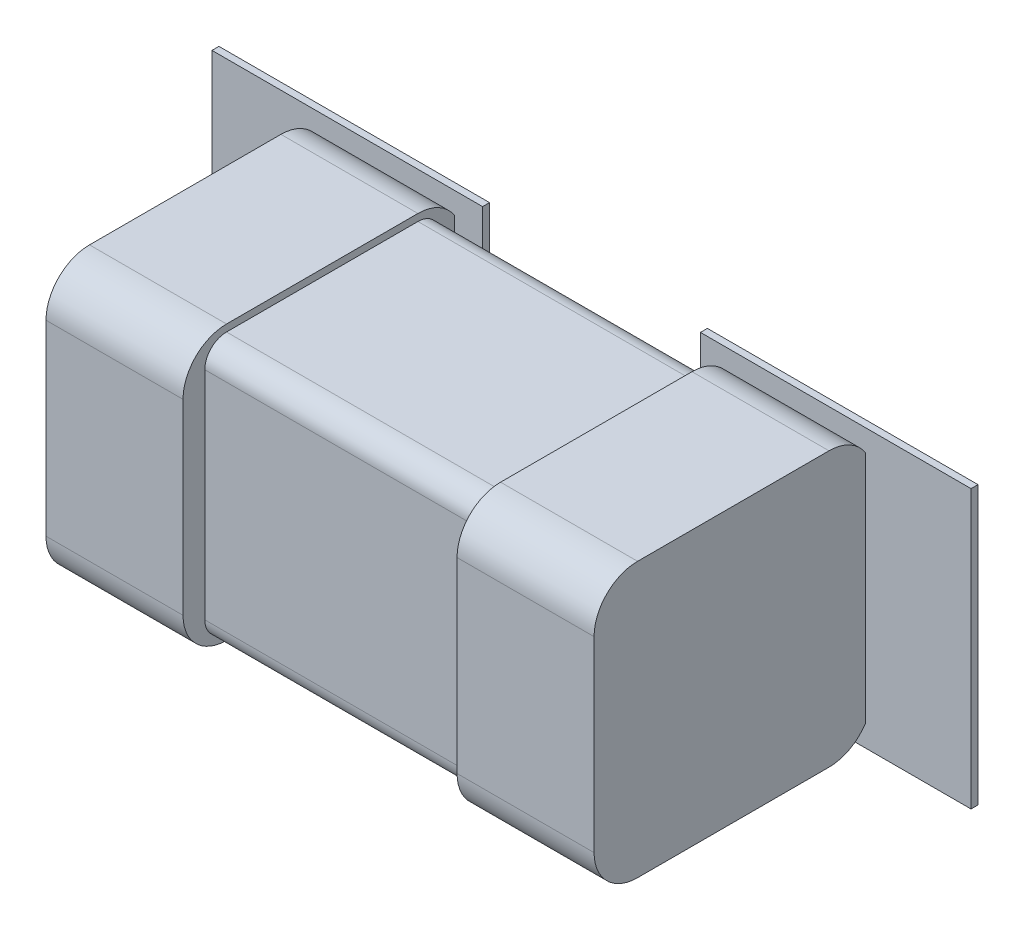
ISO-10303-21;
HEADER;
FILE_DESCRIPTION(('STEP AP214'),'2;1');
FILE_NAME('part.step','',(''),(''),'','','');
FILE_SCHEMA(('AUTOMOTIVE_DESIGN { 1 0 10303 214 1 1 1 1 }'));
ENDSEC;
DATA;
#1=APPLICATION_CONTEXT('core data for automotive mechanical design processes');
#2=APPLICATION_PROTOCOL_DEFINITION('international standard','automotive_design',2000,#1);
#3=PRODUCT_CONTEXT('',#1,'mechanical');
#4=PRODUCT('Part','Part','',(#3));
#5=PRODUCT_RELATED_PRODUCT_CATEGORY('part','',(#4));
#6=PRODUCT_DEFINITION_FORMATION('','',#4);
#7=PRODUCT_DEFINITION_CONTEXT('part definition',#1,'design');
#8=PRODUCT_DEFINITION('design','',#6,#7);
#9=PRODUCT_DEFINITION_SHAPE('','',#8);
#10=(LENGTH_UNIT() NAMED_UNIT(*) SI_UNIT(.MILLI.,.METRE.));
#11=(NAMED_UNIT(*) PLANE_ANGLE_UNIT() SI_UNIT($,.RADIAN.));
#12=(NAMED_UNIT(*) SI_UNIT($,.STERADIAN.) SOLID_ANGLE_UNIT());
#13=UNCERTAINTY_MEASURE_WITH_UNIT(LENGTH_MEASURE(1.E-05),#10,'distance_accuracy_value','');
#14=(GEOMETRIC_REPRESENTATION_CONTEXT(3) GLOBAL_UNCERTAINTY_ASSIGNED_CONTEXT((#13)) GLOBAL_UNIT_ASSIGNED_CONTEXT((#10,
#11,#12)) REPRESENTATION_CONTEXT('',''));
#15=CARTESIAN_POINT('',(0.,0.,0.));
#16=DIRECTION('',(0.,0.,1.));
#17=DIRECTION('',(1.,0.,0.));
#18=AXIS2_PLACEMENT_3D('',#15,#16,#17);
#19=CARTESIAN_POINT('',(0.,0.,0.0762));
#20=DIRECTION('',(0.,0.,1.));
#21=DIRECTION('',(1.,0.,0.));
#22=AXIS2_PLACEMENT_3D('',#19,#20,#21);
#23=PLANE('',#22);
#24=DIRECTION('',(0.,1.,0.));
#25=VECTOR('',#24,1.);
#26=CARTESIAN_POINT('',(-0.318008,-0.405003,0.0762));
#27=LINE('',#26,#25);
#28=CARTESIAN_POINT('',(-0.318008,-0.405003,0.0762));
#29=VERTEX_POINT('',#28);
#30=CARTESIAN_POINT('',(-0.318008,0.405003,0.0762));
#31=VERTEX_POINT('',#30);
#32=EDGE_CURVE('E282',#29,#31,#27,.T.);
#33=ORIENTED_EDGE('',*,*,#32,.F.);
#34=DIRECTION('',(1.,0.,0.));
#35=VECTOR('',#34,1.);
#36=CARTESIAN_POINT('',(-1.1079988,-0.405003,0.0762));
#37=LINE('',#36,#35);
#38=CARTESIAN_POINT('',(-1.1079988,-0.405003,0.0762));
#39=VERTEX_POINT('',#38);
#40=EDGE_CURVE('E287',#39,#29,#37,.T.);
#41=ORIENTED_EDGE('',*,*,#40,.F.);
#42=DIRECTION('',(0.,1.,0.));
#43=VECTOR('',#42,1.);
#44=CARTESIAN_POINT('',(-1.1079988,0.405003,0.0762));
#45=LINE('',#44,#43);
#46=CARTESIAN_POINT('',(-1.1079988,0.405003,0.0762));
#47=VERTEX_POINT('',#46);
#48=EDGE_CURVE('E259',#47,#39,#45,.F.);
#49=ORIENTED_EDGE('',*,*,#48,.F.);
#50=DIRECTION('',(1.,0.,0.));
#51=VECTOR('',#50,1.);
#52=CARTESIAN_POINT('',(-0.318008,0.405003,0.0762));
#53=LINE('',#52,#51);
#54=EDGE_CURVE('E277',#31,#47,#53,.F.);
#55=ORIENTED_EDGE('',*,*,#54,.F.);
#56=EDGE_LOOP('',(#33,#41,#49,#55));
#57=FACE_BOUND('',#56,.T.);
#58=ADVANCED_FACE('F16',(#57),#23,.F.);
#59=CARTESIAN_POINT('',(-1.1079988,-0.405003,0.0762));
#60=DIRECTION('',(0.,-1.,0.));
#61=DIRECTION('',(0.,0.,-1.));
#62=AXIS2_PLACEMENT_3D('',#59,#60,#61);
#63=PLANE('',#62);
#64=DIRECTION('',(0.,0.,1.));
#65=VECTOR('',#64,1.);
#66=CARTESIAN_POINT('',(-1.1079988,-0.405003,0.0762));
#67=LINE('',#66,#65);
#68=CARTESIAN_POINT('',(-1.1079988,-0.405003,0.09652));
#69=VERTEX_POINT('',#68);
#70=EDGE_CURVE('E275',#39,#69,#67,.T.);
#71=ORIENTED_EDGE('',*,*,#70,.F.);
#72=ORIENTED_EDGE('',*,*,#40,.T.);
#73=DIRECTION('',(0.,0.,-1.));
#74=VECTOR('',#73,1.);
#75=CARTESIAN_POINT('',(-0.318008,-0.405003,0.0762));
#76=LINE('',#75,#74);
#77=CARTESIAN_POINT('',(-0.318008,-0.405003,0.09652));
#78=VERTEX_POINT('',#77);
#79=EDGE_CURVE('E284',#78,#29,#76,.T.);
#80=ORIENTED_EDGE('',*,*,#79,.F.);
#81=DIRECTION('',(1.,0.,0.));
#82=VECTOR('',#81,1.);
#83=CARTESIAN_POINT('',(0.,-0.405003,0.09652));
#84=LINE('',#83,#82);
#85=EDGE_CURVE('E258',#69,#78,#84,.T.);
#86=ORIENTED_EDGE('',*,*,#85,.F.);
#87=EDGE_LOOP('',(#71,#72,#80,#86));
#88=FACE_BOUND('',#87,.T.);
#89=ADVANCED_FACE('F916',(#88),#63,.T.);
#90=CARTESIAN_POINT('',(-0.318008,-0.405003,0.0762));
#91=DIRECTION('',(1.,0.,0.));
#92=DIRECTION('',(0.,0.,-1.));
#93=AXIS2_PLACEMENT_3D('',#90,#91,#92);
#94=PLANE('',#93);
#95=ORIENTED_EDGE('',*,*,#79,.T.);
#96=ORIENTED_EDGE('',*,*,#32,.T.);
#97=DIRECTION('',(0.,0.,1.));
#98=VECTOR('',#97,1.);
#99=CARTESIAN_POINT('',(-0.318008,0.405003,0.0762));
#100=LINE('',#99,#98);
#101=CARTESIAN_POINT('',(-0.318008,0.405003,0.09652));
#102=VERTEX_POINT('',#101);
#103=EDGE_CURVE('E279',#102,#31,#100,.F.);
#104=ORIENTED_EDGE('',*,*,#103,.F.);
#105=DIRECTION('',(0.,1.,0.));
#106=VECTOR('',#105,1.);
#107=CARTESIAN_POINT('',(-0.318008,0.,0.09652));
#108=LINE('',#107,#106);
#109=EDGE_CURVE('E256',#78,#102,#108,.T.);
#110=ORIENTED_EDGE('',*,*,#109,.F.);
#111=EDGE_LOOP('',(#95,#96,#104,#110));
#112=FACE_BOUND('',#111,.T.);
#113=ADVANCED_FACE('F907',(#112),#94,.T.);
#114=CARTESIAN_POINT('',(-0.318008,0.405003,0.0762));
#115=DIRECTION('',(0.,1.,0.));
#116=DIRECTION('',(0.,0.,1.));
#117=AXIS2_PLACEMENT_3D('',#114,#115,#116);
#118=PLANE('',#117);
#119=ORIENTED_EDGE('',*,*,#103,.T.);
#120=ORIENTED_EDGE('',*,*,#54,.T.);
#121=DIRECTION('',(0.,0.,1.));
#122=VECTOR('',#121,1.);
#123=CARTESIAN_POINT('',(-1.1079988,0.405003,0.0762));
#124=LINE('',#123,#122);
#125=CARTESIAN_POINT('',(-1.1079988,0.405003,0.09652));
#126=VERTEX_POINT('',#125);
#127=EDGE_CURVE('E272',#126,#47,#124,.F.);
#128=ORIENTED_EDGE('',*,*,#127,.F.);
#129=DIRECTION('',(1.,0.,0.));
#130=VECTOR('',#129,1.);
#131=CARTESIAN_POINT('',(0.,0.405003,0.09652));
#132=LINE('',#131,#130);
#133=EDGE_CURVE('E254',#102,#126,#132,.F.);
#134=ORIENTED_EDGE('',*,*,#133,.F.);
#135=EDGE_LOOP('',(#119,#120,#128,#134));
#136=FACE_BOUND('',#135,.T.);
#137=ADVANCED_FACE('F898',(#136),#118,.T.);
#138=CARTESIAN_POINT('',(-1.1079988,0.405003,0.0762));
#139=DIRECTION('',(-1.,0.,0.));
#140=DIRECTION('',(0.,0.,1.));
#141=AXIS2_PLACEMENT_3D('',#138,#139,#140);
#142=PLANE('',#141);
#143=ORIENTED_EDGE('',*,*,#127,.T.);
#144=ORIENTED_EDGE('',*,*,#48,.T.);
#145=ORIENTED_EDGE('',*,*,#70,.T.);
#146=DIRECTION('',(0.,1.,0.));
#147=VECTOR('',#146,1.);
#148=CARTESIAN_POINT('',(-1.1079988,0.,0.09652));
#149=LINE('',#148,#147);
#150=EDGE_CURVE('E237',#126,#69,#149,.F.);
#151=ORIENTED_EDGE('',*,*,#150,.F.);
#152=EDGE_LOOP('',(#143,#144,#145,#151));
#153=FACE_BOUND('',#152,.T.);
#154=ADVANCED_FACE('F888',(#153),#142,.T.);
#155=CARTESIAN_POINT('',(-0.800000000000102,0.399999999999924,0.0762));
#156=DIRECTION('',(-1.,0.,0.));
#157=DIRECTION('',(0.,0.,1.));
#158=AXIS2_PLACEMENT_3D('',#155,#156,#157);
#159=PLANE('',#158);
#160=CARTESIAN_POINT('',(-0.800000000000102,0.272999999999924,0.2032));
#161=DIRECTION('',(1.,0.,0.));
#162=DIRECTION('',(0.,0.,-1.));
#163=AXIS2_PLACEMENT_3D('',#160,#161,#162);
#164=CIRCLE('',#163,0.127);
#165=CARTESIAN_POINT('',(-0.800000000000102,0.341908472628476,0.0965199999999994));
#166=VERTEX_POINT('',#165);
#167=CARTESIAN_POINT('',(-0.800000000000102,0.399999999999924,0.2032));
#168=VERTEX_POINT('',#167);
#169=EDGE_CURVE('E231',#166,#168,#164,.T.);
#170=ORIENTED_EDGE('',*,*,#169,.F.);
#171=DIRECTION('',(0.,1.,0.));
#172=VECTOR('',#171,1.);
#173=CARTESIAN_POINT('',(-0.800000000000102,0.,0.09652));
#174=LINE('',#173,#172);
#175=CARTESIAN_POINT('',(-0.800000000000102,-0.341908472628476,0.0965199999999994));
#176=VERTEX_POINT('',#175);
#177=EDGE_CURVE('E226',#176,#166,#174,.T.);
#178=ORIENTED_EDGE('',*,*,#177,.F.);
#179=CARTESIAN_POINT('',(-0.800000000000102,-0.272999999999924,0.2032));
#180=DIRECTION('',(1.,0.,0.));
#181=DIRECTION('',(0.,0.,-1.));
#182=AXIS2_PLACEMENT_3D('',#179,#180,#181);
#183=CIRCLE('',#182,0.127);
#184=CARTESIAN_POINT('',(-0.800000000000102,-0.399999999999924,0.2032));
#185=VERTEX_POINT('',#184);
#186=EDGE_CURVE('E19',#185,#176,#183,.T.);
#187=ORIENTED_EDGE('',*,*,#186,.F.);
#188=DIRECTION('',(0.,0.,-1.));
#189=VECTOR('',#188,1.);
#190=CARTESIAN_POINT('',(-0.800000000000102,-0.399999999999924,0.0762));
#191=LINE('',#190,#189);
#192=CARTESIAN_POINT('',(-0.800000000000102,-0.399999999999924,0.762));
#193=VERTEX_POINT('',#192);
#194=EDGE_CURVE('E221',#193,#185,#191,.T.);
#195=ORIENTED_EDGE('',*,*,#194,.F.);
#196=CARTESIAN_POINT('',(-0.800000000000102,-0.272999999999924,0.762));
#197=DIRECTION('',(1.,0.,0.));
#198=DIRECTION('',(0.,0.,-1.));
#199=AXIS2_PLACEMENT_3D('',#196,#197,#198);
#200=CIRCLE('',#199,0.127);
#201=CARTESIAN_POINT('',(-0.800000000000102,-0.272999999999924,0.889));
#202=VERTEX_POINT('',#201);
#203=EDGE_CURVE('E368',#202,#193,#200,.T.);
#204=ORIENTED_EDGE('',*,*,#203,.F.);
#205=DIRECTION('',(0.,1.,0.));
#206=VECTOR('',#205,1.);
#207=CARTESIAN_POINT('',(-0.800000000000102,0.,0.889));
#208=LINE('',#207,#206);
#209=CARTESIAN_POINT('',(-0.800000000000102,0.272999999999924,0.889));
#210=VERTEX_POINT('',#209);
#211=EDGE_CURVE('E265',#210,#202,#208,.F.);
#212=ORIENTED_EDGE('',*,*,#211,.F.);
#213=CARTESIAN_POINT('',(-0.800000000000102,0.272999999999924,0.762));
#214=DIRECTION('',(-1.,0.,0.));
#215=DIRECTION('',(0.,0.,1.));
#216=AXIS2_PLACEMENT_3D('',#213,#214,#215);
#217=CIRCLE('',#216,0.127);
#218=CARTESIAN_POINT('',(-0.800000000000102,0.399999999999924,0.762));
#219=VERTEX_POINT('',#218);
#220=EDGE_CURVE('E264',#219,#210,#217,.F.);
#221=ORIENTED_EDGE('',*,*,#220,.F.);
#222=DIRECTION('',(0.,0.,1.));
#223=VECTOR('',#222,1.);
#224=CARTESIAN_POINT('',(-0.800000000000102,0.399999999999924,0.0762));
#225=LINE('',#224,#223);
#226=EDGE_CURVE('E261',#168,#219,#225,.T.);
#227=ORIENTED_EDGE('',*,*,#226,.F.);
#228=EDGE_LOOP('',(#170,#178,#187,#195,#204,#212,#221,#227));
#229=FACE_BOUND('',#228,.T.);
#230=ADVANCED_FACE('F228',(#229),#159,.T.);
#231=CARTESIAN_POINT('',(0.,0.,0.09652));
#232=DIRECTION('',(0.,0.,1.));
#233=DIRECTION('',(1.,0.,0.));
#234=AXIS2_PLACEMENT_3D('',#231,#232,#233);
#235=PLANE('',#234);
#236=DIRECTION('',(1.,0.,0.));
#237=VECTOR('',#236,1.);
#238=CARTESIAN_POINT('',(0.800000000000102,-0.341908472628475,0.0965199999999988));
#239=LINE('',#238,#237);
#240=CARTESIAN_POINT('',(-0.399999999999924,-0.341908472628476,0.0965199999999994));
#241=VERTEX_POINT('',#240);
#242=EDGE_CURVE('E236',#176,#241,#239,.T.);
#243=ORIENTED_EDGE('',*,*,#242,.F.);
#244=ORIENTED_EDGE('',*,*,#177,.T.);
#245=DIRECTION('',(1.,0.,0.));
#246=VECTOR('',#245,1.);
#247=CARTESIAN_POINT('',(0.800000000000102,0.341908472628475,0.0965199999999988));
#248=LINE('',#247,#246);
#249=CARTESIAN_POINT('',(-0.399999999999924,0.341908472628476,0.0965199999999994));
#250=VERTEX_POINT('',#249);
#251=EDGE_CURVE('E365',#250,#166,#248,.F.);
#252=ORIENTED_EDGE('',*,*,#251,.F.);
#253=DIRECTION('',(0.,1.,0.));
#254=VECTOR('',#253,1.);
#255=CARTESIAN_POINT('',(-0.399999999999924,0.399999999999924,0.09652));
#256=LINE('',#255,#254);
#257=EDGE_CURVE('E247',#250,#241,#256,.F.);
#258=ORIENTED_EDGE('',*,*,#257,.T.);
#259=EDGE_LOOP('',(#243,#244,#252,#258));
#260=FACE_BOUND('',#259,.T.);
#261=ORIENTED_EDGE('',*,*,#133,.T.);
#262=ORIENTED_EDGE('',*,*,#150,.T.);
#263=ORIENTED_EDGE('',*,*,#85,.T.);
#264=ORIENTED_EDGE('',*,*,#109,.T.);
#265=EDGE_LOOP('',(#261,#262,#263,#264));
#266=FACE_BOUND('',#265,.T.);
#267=ADVANCED_FACE('F245',(#260,#266),#235,.T.);
#268=CARTESIAN_POINT('',(0.800000000000102,-0.272999999999924,0.2032));
#269=DIRECTION('',(1.,0.,0.));
#270=DIRECTION('',(0.,0.,-1.));
#271=AXIS2_PLACEMENT_3D('',#268,#269,#270);
#272=CYLINDRICAL_SURFACE('',#271,0.127);
#273=DIRECTION('',(1.,0.,0.));
#274=VECTOR('',#273,1.);
#275=CARTESIAN_POINT('',(-0.800000000000102,-0.399999999999924,0.2032));
#276=LINE('',#275,#274);
#277=CARTESIAN_POINT('',(-0.399999999999924,-0.399999999999924,0.2032));
#278=VERTEX_POINT('',#277);
#279=EDGE_CURVE('E243',#185,#278,#276,.T.);
#280=ORIENTED_EDGE('',*,*,#279,.F.);
#281=ORIENTED_EDGE('',*,*,#186,.T.);
#282=ORIENTED_EDGE('',*,*,#242,.T.);
#283=CARTESIAN_POINT('',(-0.399999999999924,-0.272999999999924,0.2032));
#284=DIRECTION('',(1.,0.,0.));
#285=DIRECTION('',(0.,0.,-1.));
#286=AXIS2_PLACEMENT_3D('',#283,#284,#285);
#287=CIRCLE('',#286,0.127);
#288=EDGE_CURVE('E362',#241,#278,#287,.F.);
#289=ORIENTED_EDGE('',*,*,#288,.T.);
#290=EDGE_LOOP('',(#280,#281,#282,#289));
#291=FACE_BOUND('',#290,.T.);
#292=ADVANCED_FACE('F240',(#291),#272,.T.);
#293=CARTESIAN_POINT('',(-0.800000000000102,-0.399999999999924,0.0762));
#294=DIRECTION('',(0.,-1.,0.));
#295=DIRECTION('',(0.,0.,-1.));
#296=AXIS2_PLACEMENT_3D('',#293,#294,#295);
#297=PLANE('',#296);
#298=ORIENTED_EDGE('',*,*,#194,.T.);
#299=ORIENTED_EDGE('',*,*,#279,.T.);
#300=DIRECTION('',(0.,0.,1.));
#301=VECTOR('',#300,1.);
#302=CARTESIAN_POINT('',(-0.399999999999924,-0.399999999999924,0.889));
#303=LINE('',#302,#301);
#304=CARTESIAN_POINT('',(-0.399999999999924,-0.399999999999924,0.762));
#305=VERTEX_POINT('',#304);
#306=EDGE_CURVE('E361',#278,#305,#303,.T.);
#307=ORIENTED_EDGE('',*,*,#306,.T.);
#308=DIRECTION('',(1.,0.,0.));
#309=VECTOR('',#308,1.);
#310=CARTESIAN_POINT('',(-0.80383708957051,-0.399999999999924,0.762));
#311=LINE('',#310,#309);
#312=EDGE_CURVE('E268',#193,#305,#311,.T.);
#313=ORIENTED_EDGE('',*,*,#312,.F.);
#314=EDGE_LOOP('',(#298,#299,#307,#313));
#315=FACE_BOUND('',#314,.T.);
#316=ADVANCED_FACE('F374',(#315),#297,.T.);
#317=CARTESIAN_POINT('',(-0.80383708957051,-0.272999999999924,0.762));
#318=DIRECTION('',(1.,0.,0.));
#319=DIRECTION('',(0.,0.,-1.));
#320=AXIS2_PLACEMENT_3D('',#317,#318,#319);
#321=CYLINDRICAL_SURFACE('',#320,0.127);
#322=ORIENTED_EDGE('',*,*,#312,.T.);
#323=CARTESIAN_POINT('',(-0.399999999999924,-0.272999999999924,0.762));
#324=DIRECTION('',(1.,0.,0.));
#325=DIRECTION('',(0.,0.,-1.));
#326=AXIS2_PLACEMENT_3D('',#323,#324,#325);
#327=CIRCLE('',#326,0.127);
#328=CARTESIAN_POINT('',(-0.399999999999924,-0.272999999999924,0.889));
#329=VERTEX_POINT('',#328);
#330=EDGE_CURVE('E358',#305,#329,#327,.F.);
#331=ORIENTED_EDGE('',*,*,#330,.T.);
#332=DIRECTION('',(1.,0.,0.));
#333=VECTOR('',#332,1.);
#334=CARTESIAN_POINT('',(0.,-0.272999999999924,0.889));
#335=LINE('',#334,#333);
#336=EDGE_CURVE('E267',#202,#329,#335,.T.);
#337=ORIENTED_EDGE('',*,*,#336,.F.);
#338=ORIENTED_EDGE('',*,*,#203,.T.);
#339=EDGE_LOOP('',(#322,#331,#337,#338));
#340=FACE_BOUND('',#339,.T.);
#341=ADVANCED_FACE('F401',(#340),#321,.T.);
#342=CARTESIAN_POINT('',(0.,0.,0.889));
#343=DIRECTION('',(0.,0.,1.));
#344=DIRECTION('',(1.,0.,0.));
#345=AXIS2_PLACEMENT_3D('',#342,#343,#344);
#346=PLANE('',#345);
#347=DIRECTION('',(0.,1.,0.));
#348=VECTOR('',#347,1.);
#349=CARTESIAN_POINT('',(-0.399999999999924,0.399999999999924,0.889));
#350=LINE('',#349,#348);
#351=CARTESIAN_POINT('',(-0.399999999999924,0.272999999999924,0.889));
#352=VERTEX_POINT('',#351);
#353=EDGE_CURVE('E357',#329,#352,#350,.T.);
#354=ORIENTED_EDGE('',*,*,#353,.T.);
#355=DIRECTION('',(-1.,0.,0.));
#356=VECTOR('',#355,1.);
#357=CARTESIAN_POINT('',(0.803689463133988,0.272999999999924,0.889));
#358=LINE('',#357,#356);
#359=EDGE_CURVE('E367',#210,#352,#358,.F.);
#360=ORIENTED_EDGE('',*,*,#359,.F.);
#361=ORIENTED_EDGE('',*,*,#211,.T.);
#362=ORIENTED_EDGE('',*,*,#336,.T.);
#363=EDGE_LOOP('',(#354,#360,#361,#362));
#364=FACE_BOUND('',#363,.T.);
#365=ADVANCED_FACE('F398',(#364),#346,.T.);
#366=CARTESIAN_POINT('',(0.803689463133988,0.272999999999924,0.762));
#367=DIRECTION('',(-1.,0.,0.));
#368=DIRECTION('',(0.,0.,1.));
#369=AXIS2_PLACEMENT_3D('',#366,#367,#368);
#370=CYLINDRICAL_SURFACE('',#369,0.127);
#371=DIRECTION('',(1.,0.,0.));
#372=VECTOR('',#371,1.);
#373=CARTESIAN_POINT('',(0.800000000000102,0.399999999999924,0.762));
#374=LINE('',#373,#372);
#375=CARTESIAN_POINT('',(-0.399999999999924,0.399999999999924,0.762));
#376=VERTEX_POINT('',#375);
#377=EDGE_CURVE('E263',#219,#376,#374,.T.);
#378=ORIENTED_EDGE('',*,*,#377,.F.);
#379=ORIENTED_EDGE('',*,*,#220,.T.);
#380=ORIENTED_EDGE('',*,*,#359,.T.);
#381=CARTESIAN_POINT('',(-0.399999999999924,0.272999999999924,0.762));
#382=DIRECTION('',(-1.,0.,0.));
#383=DIRECTION('',(0.,0.,1.));
#384=AXIS2_PLACEMENT_3D('',#381,#382,#383);
#385=CIRCLE('',#384,0.127);
#386=EDGE_CURVE('E354',#352,#376,#385,.T.);
#387=ORIENTED_EDGE('',*,*,#386,.T.);
#388=EDGE_LOOP('',(#378,#379,#380,#387));
#389=FACE_BOUND('',#388,.T.);
#390=ADVANCED_FACE('F409',(#389),#370,.T.);
#391=CARTESIAN_POINT('',(0.800000000000102,0.399999999999924,0.0762));
#392=DIRECTION('',(0.,1.,0.));
#393=DIRECTION('',(0.,0.,1.));
#394=AXIS2_PLACEMENT_3D('',#391,#392,#393);
#395=PLANE('',#394);
#396=DIRECTION('',(0.,0.,1.));
#397=VECTOR('',#396,1.);
#398=CARTESIAN_POINT('',(-0.399999999999924,0.399999999999924,0.889));
#399=LINE('',#398,#397);
#400=CARTESIAN_POINT('',(-0.399999999999924,0.399999999999924,0.2032));
#401=VERTEX_POINT('',#400);
#402=EDGE_CURVE('E353',#376,#401,#399,.F.);
#403=ORIENTED_EDGE('',*,*,#402,.T.);
#404=DIRECTION('',(1.,0.,0.));
#405=VECTOR('',#404,1.);
#406=CARTESIAN_POINT('',(0.800000000000102,0.399999999999924,0.2032));
#407=LINE('',#406,#405);
#408=EDGE_CURVE('E391',#168,#401,#407,.T.);
#409=ORIENTED_EDGE('',*,*,#408,.F.);
#410=ORIENTED_EDGE('',*,*,#226,.T.);
#411=ORIENTED_EDGE('',*,*,#377,.T.);
#412=EDGE_LOOP('',(#403,#409,#410,#411));
#413=FACE_BOUND('',#412,.T.);
#414=ADVANCED_FACE('F513',(#413),#395,.T.);
#415=CARTESIAN_POINT('',(0.800000000000102,0.272999999999924,0.2032));
#416=DIRECTION('',(1.,0.,0.));
#417=DIRECTION('',(0.,0.,-1.));
#418=AXIS2_PLACEMENT_3D('',#415,#416,#417);
#419=CYLINDRICAL_SURFACE('',#418,0.127);
#420=ORIENTED_EDGE('',*,*,#251,.T.);
#421=ORIENTED_EDGE('',*,*,#169,.T.);
#422=ORIENTED_EDGE('',*,*,#408,.T.);
#423=CARTESIAN_POINT('',(-0.399999999999924,0.272999999999924,0.2032));
#424=DIRECTION('',(1.,0.,0.));
#425=DIRECTION('',(0.,0.,-1.));
#426=AXIS2_PLACEMENT_3D('',#423,#424,#425);
#427=CIRCLE('',#426,0.127);
#428=EDGE_CURVE('E350',#401,#250,#427,.F.);
#429=ORIENTED_EDGE('',*,*,#428,.T.);
#430=EDGE_LOOP('',(#420,#421,#422,#429));
#431=FACE_BOUND('',#430,.T.);
#432=ADVANCED_FACE('F509',(#431),#419,.T.);
#433=CARTESIAN_POINT('',(-0.399999999999924,0.399999999999924,0.889));
#434=DIRECTION('',(-1.,0.,0.));
#435=DIRECTION('',(0.,0.,1.));
#436=AXIS2_PLACEMENT_3D('',#433,#434,#435);
#437=PLANE('',#436);
#438=DIRECTION('',(0.,1.,0.));
#439=VECTOR('',#438,1.);
#440=CARTESIAN_POINT('',(-0.399999999999924,0.379679999999924,0.1397));
#441=LINE('',#440,#439);
#442=CARTESIAN_POINT('',(-0.399999999999924,0.316179999999924,0.1397));
#443=VERTEX_POINT('',#442);
#444=CARTESIAN_POINT('',(-0.399999999999924,-0.316179999999924,0.1397));
#445=VERTEX_POINT('',#444);
#446=EDGE_CURVE('E341',#443,#445,#441,.F.);
#447=ORIENTED_EDGE('',*,*,#446,.T.);
#448=CARTESIAN_POINT('',(-0.399999999999924,-0.316179999999924,0.2032));
#449=DIRECTION('',(1.,0.,0.));
#450=DIRECTION('',(0.,0.,-1.));
#451=AXIS2_PLACEMENT_3D('',#448,#449,#450);
#452=CIRCLE('',#451,0.0635);
#453=CARTESIAN_POINT('',(-0.399999999999924,-0.379679999999924,0.2032));
#454=VERTEX_POINT('',#453);
#455=EDGE_CURVE('E338',#454,#445,#452,.T.);
#456=ORIENTED_EDGE('',*,*,#455,.F.);
#457=DIRECTION('',(0.,0.,1.));
#458=VECTOR('',#457,1.);
#459=CARTESIAN_POINT('',(-0.399999999999924,-0.379679999999924,0.889));
#460=LINE('',#459,#458);
#461=CARTESIAN_POINT('',(-0.399999999999924,-0.379679999999924,0.762));
#462=VERTEX_POINT('',#461);
#463=EDGE_CURVE('E337',#454,#462,#460,.T.);
#464=ORIENTED_EDGE('',*,*,#463,.T.);
#465=CARTESIAN_POINT('',(-0.399999999999924,-0.316179999999924,0.762));
#466=DIRECTION('',(-1.,0.,0.));
#467=DIRECTION('',(0.,0.,1.));
#468=AXIS2_PLACEMENT_3D('',#465,#466,#467);
#469=CIRCLE('',#468,0.0635);
#470=CARTESIAN_POINT('',(-0.399999999999924,-0.316179999999924,0.8255));
#471=VERTEX_POINT('',#470);
#472=EDGE_CURVE('E334',#471,#462,#469,.F.);
#473=ORIENTED_EDGE('',*,*,#472,.F.);
#474=DIRECTION('',(0.,1.,0.));
#475=VECTOR('',#474,1.);
#476=CARTESIAN_POINT('',(-0.399999999999924,0.379679999999924,0.8255));
#477=LINE('',#476,#475);
#478=CARTESIAN_POINT('',(-0.399999999999924,0.316179999999924,0.8255));
#479=VERTEX_POINT('',#478);
#480=EDGE_CURVE('E349',#471,#479,#477,.T.);
#481=ORIENTED_EDGE('',*,*,#480,.T.);
#482=CARTESIAN_POINT('',(-0.399999999999924,0.316179999999924,0.762));
#483=DIRECTION('',(1.,0.,0.));
#484=DIRECTION('',(0.,0.,-1.));
#485=AXIS2_PLACEMENT_3D('',#482,#483,#484);
#486=CIRCLE('',#485,0.0635);
#487=CARTESIAN_POINT('',(-0.399999999999924,0.379679999999924,0.762));
#488=VERTEX_POINT('',#487);
#489=EDGE_CURVE('E346',#488,#479,#486,.T.);
#490=ORIENTED_EDGE('',*,*,#489,.F.);
#491=DIRECTION('',(0.,0.,-1.));
#492=VECTOR('',#491,1.);
#493=CARTESIAN_POINT('',(-0.399999999999924,0.379679999999924,0.889));
#494=LINE('',#493,#492);
#495=CARTESIAN_POINT('',(-0.399999999999924,0.379679999999924,0.2032));
#496=VERTEX_POINT('',#495);
#497=EDGE_CURVE('E345',#488,#496,#494,.T.);
#498=ORIENTED_EDGE('',*,*,#497,.T.);
#499=CARTESIAN_POINT('',(-0.399999999999924,0.316179999999924,0.2032));
#500=DIRECTION('',(-1.,0.,0.));
#501=DIRECTION('',(0.,0.,1.));
#502=AXIS2_PLACEMENT_3D('',#499,#500,#501);
#503=CIRCLE('',#502,0.0635);
#504=EDGE_CURVE('E342',#443,#496,#503,.F.);
#505=ORIENTED_EDGE('',*,*,#504,.F.);
#506=EDGE_LOOP('',(#447,#456,#464,#473,#481,#490,#498,#505));
#507=FACE_BOUND('',#506,.T.);
#508=ORIENTED_EDGE('',*,*,#402,.F.);
#509=ORIENTED_EDGE('',*,*,#386,.F.);
#510=ORIENTED_EDGE('',*,*,#353,.F.);
#511=ORIENTED_EDGE('',*,*,#330,.F.);
#512=ORIENTED_EDGE('',*,*,#306,.F.);
#513=ORIENTED_EDGE('',*,*,#288,.F.);
#514=ORIENTED_EDGE('',*,*,#257,.F.);
#515=ORIENTED_EDGE('',*,*,#428,.F.);
#516=EDGE_LOOP('',(#508,#509,#510,#511,#512,#513,#514,#515));
#517=FACE_BOUND('',#516,.T.);
#518=ADVANCED_FACE('F378',(#507,#517),#437,.F.);
#519=CARTESIAN_POINT('',(0.399999999999924,0.379679999999924,0.8255));
#520=DIRECTION('',(0.,0.,-1.));
#521=DIRECTION('',(-1.,0.,0.));
#522=AXIS2_PLACEMENT_3D('',#519,#520,#521);
#523=PLANE('',#522);
#524=DIRECTION('',(-1.,0.,0.));
#525=VECTOR('',#524,1.);
#526=CARTESIAN_POINT('',(0.403837089570586,-0.316179999999924,0.8255));
#527=LINE('',#526,#525);
#528=CARTESIAN_POINT('',(0.399999999999924,-0.316179999999924,0.8255));
#529=VERTEX_POINT('',#528);
#530=EDGE_CURVE('E542',#529,#471,#527,.T.);
#531=ORIENTED_EDGE('',*,*,#530,.F.);
#532=DIRECTION('',(0.,1.,0.));
#533=VECTOR('',#532,1.);
#534=CARTESIAN_POINT('',(0.399999999999924,0.379679999999924,0.8255));
#535=LINE('',#534,#533);
#536=CARTESIAN_POINT('',(0.399999999999924,0.316179999999924,0.8255));
#537=VERTEX_POINT('',#536);
#538=EDGE_CURVE('E321',#529,#537,#535,.T.);
#539=ORIENTED_EDGE('',*,*,#538,.T.);
#540=DIRECTION('',(1.,0.,0.));
#541=VECTOR('',#540,1.);
#542=CARTESIAN_POINT('',(-0.404022146645226,0.316179999999924,0.8255));
#543=LINE('',#542,#541);
#544=EDGE_CURVE('E348',#479,#537,#543,.T.);
#545=ORIENTED_EDGE('',*,*,#544,.F.);
#546=ORIENTED_EDGE('',*,*,#480,.F.);
#547=EDGE_LOOP('',(#531,#539,#545,#546));
#548=FACE_BOUND('',#547,.T.);
#549=ADVANCED_FACE('F502',(#548),#523,.F.);
#550=CARTESIAN_POINT('',(-0.404022146645226,0.316179999999924,0.762));
#551=DIRECTION('',(1.,0.,0.));
#552=DIRECTION('',(0.,0.,-1.));
#553=AXIS2_PLACEMENT_3D('',#550,#551,#552);
#554=CYLINDRICAL_SURFACE('',#553,0.0635);
#555=ORIENTED_EDGE('',*,*,#489,.T.);
#556=ORIENTED_EDGE('',*,*,#544,.T.);
#557=CARTESIAN_POINT('',(0.399999999999924,0.316179999999924,0.762));
#558=DIRECTION('',(1.,0.,0.));
#559=DIRECTION('',(0.,0.,-1.));
#560=AXIS2_PLACEMENT_3D('',#557,#558,#559);
#561=CIRCLE('',#560,0.0635);
#562=CARTESIAN_POINT('',(0.399999999999924,0.379679999999924,0.762));
#563=VERTEX_POINT('',#562);
#564=EDGE_CURVE('E318',#537,#563,#561,.F.);
#565=ORIENTED_EDGE('',*,*,#564,.T.);
#566=DIRECTION('',(1.,0.,0.));
#567=VECTOR('',#566,1.);
#568=CARTESIAN_POINT('',(-0.399999999999924,0.379679999999924,0.762));
#569=LINE('',#568,#567);
#570=EDGE_CURVE('E390',#563,#488,#569,.F.);
#571=ORIENTED_EDGE('',*,*,#570,.T.);
#572=EDGE_LOOP('',(#555,#556,#565,#571));
#573=FACE_BOUND('',#572,.T.);
#574=ADVANCED_FACE('F498',(#573),#554,.T.);
#575=CARTESIAN_POINT('',(-0.399999999999924,0.379679999999924,0.889));
#576=DIRECTION('',(0.,-1.,0.));
#577=DIRECTION('',(0.,0.,-1.));
#578=AXIS2_PLACEMENT_3D('',#575,#576,#577);
#579=PLANE('',#578);
#580=ORIENTED_EDGE('',*,*,#570,.F.);
#581=DIRECTION('',(0.,0.,-1.));
#582=VECTOR('',#581,1.);
#583=CARTESIAN_POINT('',(0.399999999999924,0.379679999999924,0.889));
#584=LINE('',#583,#582);
#585=CARTESIAN_POINT('',(0.399999999999924,0.379679999999924,0.2032));
#586=VERTEX_POINT('',#585);
#587=EDGE_CURVE('E317',#563,#586,#584,.T.);
#588=ORIENTED_EDGE('',*,*,#587,.T.);
#589=DIRECTION('',(-1.,0.,0.));
#590=VECTOR('',#589,1.);
#591=CARTESIAN_POINT('',(0.40368946313381,0.379679999999924,0.2032));
#592=LINE('',#591,#590);
#593=EDGE_CURVE('E344',#496,#586,#592,.F.);
#594=ORIENTED_EDGE('',*,*,#593,.F.);
#595=ORIENTED_EDGE('',*,*,#497,.F.);
#596=EDGE_LOOP('',(#580,#588,#594,#595));
#597=FACE_BOUND('',#596,.T.);
#598=ADVANCED_FACE('F494',(#597),#579,.F.);
#599=CARTESIAN_POINT('',(0.40368946313381,0.316179999999924,0.2032));
#600=DIRECTION('',(-1.,0.,0.));
#601=DIRECTION('',(0.,0.,1.));
#602=AXIS2_PLACEMENT_3D('',#599,#600,#601);
#603=CYLINDRICAL_SURFACE('',#602,0.0635);
#604=CARTESIAN_POINT('',(0.399999999999924,0.316179999999924,0.2032));
#605=DIRECTION('',(-1.,0.,0.));
#606=DIRECTION('',(0.,0.,1.));
#607=AXIS2_PLACEMENT_3D('',#604,#605,#606);
#608=CIRCLE('',#607,0.0635);
#609=CARTESIAN_POINT('',(0.399999999999924,0.316179999999924,0.1397));
#610=VERTEX_POINT('',#609);
#611=EDGE_CURVE('E314',#586,#610,#608,.T.);
#612=ORIENTED_EDGE('',*,*,#611,.T.);
#613=DIRECTION('',(1.,0.,0.));
#614=VECTOR('',#613,1.);
#615=CARTESIAN_POINT('',(-0.399999999999924,0.316179999999924,0.1397));
#616=LINE('',#615,#614);
#617=EDGE_CURVE('E387',#610,#443,#616,.F.);
#618=ORIENTED_EDGE('',*,*,#617,.T.);
#619=ORIENTED_EDGE('',*,*,#504,.T.);
#620=ORIENTED_EDGE('',*,*,#593,.T.);
#621=EDGE_LOOP('',(#612,#618,#619,#620));
#622=FACE_BOUND('',#621,.T.);
#623=ADVANCED_FACE('F490',(#622),#603,.T.);
#624=CARTESIAN_POINT('',(-0.399999999999924,0.379679999999924,0.1397));
#625=DIRECTION('',(0.,0.,1.));
#626=DIRECTION('',(1.,0.,0.));
#627=AXIS2_PLACEMENT_3D('',#624,#625,#626);
#628=PLANE('',#627);
#629=DIRECTION('',(1.,0.,0.));
#630=VECTOR('',#629,1.);
#631=CARTESIAN_POINT('',(-0.40368946313381,-0.316179999999924,0.1397));
#632=LINE('',#631,#630);
#633=CARTESIAN_POINT('',(0.399999999999924,-0.316179999999924,0.1397));
#634=VERTEX_POINT('',#633);
#635=EDGE_CURVE('E340',#445,#634,#632,.T.);
#636=ORIENTED_EDGE('',*,*,#635,.F.);
#637=ORIENTED_EDGE('',*,*,#446,.F.);
#638=ORIENTED_EDGE('',*,*,#617,.F.);
#639=DIRECTION('',(0.,1.,0.));
#640=VECTOR('',#639,1.);
#641=CARTESIAN_POINT('',(0.399999999999924,0.379679999999924,0.1397));
#642=LINE('',#641,#640);
#643=EDGE_CURVE('E313',#610,#634,#642,.F.);
#644=ORIENTED_EDGE('',*,*,#643,.T.);
#645=EDGE_LOOP('',(#636,#637,#638,#644));
#646=FACE_BOUND('',#645,.T.);
#647=ADVANCED_FACE('F486',(#646),#628,.F.);
#648=CARTESIAN_POINT('',(-0.40368946313381,-0.316179999999924,0.2032));
#649=DIRECTION('',(1.,0.,0.));
#650=DIRECTION('',(0.,0.,-1.));
#651=AXIS2_PLACEMENT_3D('',#648,#649,#650);
#652=CYLINDRICAL_SURFACE('',#651,0.0635);
#653=ORIENTED_EDGE('',*,*,#455,.T.);
#654=ORIENTED_EDGE('',*,*,#635,.T.);
#655=CARTESIAN_POINT('',(0.399999999999924,-0.316179999999924,0.2032));
#656=DIRECTION('',(1.,0.,0.));
#657=DIRECTION('',(0.,0.,-1.));
#658=AXIS2_PLACEMENT_3D('',#655,#656,#657);
#659=CIRCLE('',#658,0.0635);
#660=CARTESIAN_POINT('',(0.399999999999924,-0.379679999999924,0.2032));
#661=VERTEX_POINT('',#660);
#662=EDGE_CURVE('E310',#634,#661,#659,.F.);
#663=ORIENTED_EDGE('',*,*,#662,.T.);
#664=DIRECTION('',(1.,0.,0.));
#665=VECTOR('',#664,1.);
#666=CARTESIAN_POINT('',(0.399999999999924,-0.379679999999924,0.2032));
#667=LINE('',#666,#665);
#668=EDGE_CURVE('E530',#661,#454,#667,.F.);
#669=ORIENTED_EDGE('',*,*,#668,.T.);
#670=EDGE_LOOP('',(#653,#654,#663,#669));
#671=FACE_BOUND('',#670,.T.);
#672=ADVANCED_FACE('F482',(#671),#652,.T.);
#673=CARTESIAN_POINT('',(0.399999999999924,-0.379679999999924,0.889));
#674=DIRECTION('',(0.,1.,0.));
#675=DIRECTION('',(0.,0.,1.));
#676=AXIS2_PLACEMENT_3D('',#673,#674,#675);
#677=PLANE('',#676);
#678=ORIENTED_EDGE('',*,*,#668,.F.);
#679=DIRECTION('',(0.,0.,-1.));
#680=VECTOR('',#679,1.);
#681=CARTESIAN_POINT('',(0.399999999999924,-0.379679999999924,0.889));
#682=LINE('',#681,#680);
#683=CARTESIAN_POINT('',(0.399999999999924,-0.379679999999924,0.762));
#684=VERTEX_POINT('',#683);
#685=EDGE_CURVE('E309',#661,#684,#682,.F.);
#686=ORIENTED_EDGE('',*,*,#685,.T.);
#687=DIRECTION('',(-1.,0.,0.));
#688=VECTOR('',#687,1.);
#689=CARTESIAN_POINT('',(0.403837089570586,-0.379679999999924,0.762));
#690=LINE('',#689,#688);
#691=EDGE_CURVE('E336',#462,#684,#690,.F.);
#692=ORIENTED_EDGE('',*,*,#691,.F.);
#693=ORIENTED_EDGE('',*,*,#463,.F.);
#694=EDGE_LOOP('',(#678,#686,#692,#693));
#695=FACE_BOUND('',#694,.T.);
#696=ADVANCED_FACE('F478',(#695),#677,.F.);
#697=CARTESIAN_POINT('',(0.403837089570586,-0.316179999999924,0.762));
#698=DIRECTION('',(-1.,0.,0.));
#699=DIRECTION('',(0.,0.,1.));
#700=AXIS2_PLACEMENT_3D('',#697,#698,#699);
#701=CYLINDRICAL_SURFACE('',#700,0.0635);
#702=CARTESIAN_POINT('',(0.399999999999924,-0.316179999999924,0.762));
#703=DIRECTION('',(-1.,0.,0.));
#704=DIRECTION('',(0.,0.,1.));
#705=AXIS2_PLACEMENT_3D('',#702,#703,#704);
#706=CIRCLE('',#705,0.0635);
#707=EDGE_CURVE('E306',#684,#529,#706,.T.);
#708=ORIENTED_EDGE('',*,*,#707,.T.);
#709=ORIENTED_EDGE('',*,*,#530,.T.);
#710=ORIENTED_EDGE('',*,*,#472,.T.);
#711=ORIENTED_EDGE('',*,*,#691,.T.);
#712=EDGE_LOOP('',(#708,#709,#710,#711));
#713=FACE_BOUND('',#712,.T.);
#714=ADVANCED_FACE('F474',(#713),#701,.T.);
#715=CARTESIAN_POINT('',(0.800000000000102,0.399999999999924,0.0762));
#716=DIRECTION('',(0.,1.,0.));
#717=DIRECTION('',(0.,0.,1.));
#718=AXIS2_PLACEMENT_3D('',#715,#716,#717);
#719=PLANE('',#718);
#720=DIRECTION('',(0.,0.,-1.));
#721=VECTOR('',#720,1.);
#722=CARTESIAN_POINT('',(0.800000000000102,0.399999999999924,0.0762));
#723=LINE('',#722,#721);
#724=CARTESIAN_POINT('',(0.800000000000102,0.399999999999924,0.2032));
#725=VERTEX_POINT('',#724);
#726=CARTESIAN_POINT('',(0.800000000000102,0.399999999999924,0.762));
#727=VERTEX_POINT('',#726);
#728=EDGE_CURVE('E298',#725,#727,#723,.F.);
#729=ORIENTED_EDGE('',*,*,#728,.F.);
#730=DIRECTION('',(1.,0.,0.));
#731=VECTOR('',#730,1.);
#732=CARTESIAN_POINT('',(0.800000000000102,0.399999999999924,0.2032));
#733=LINE('',#732,#731);
#734=CARTESIAN_POINT('',(0.399999999999924,0.399999999999924,0.2032));
#735=VERTEX_POINT('',#734);
#736=EDGE_CURVE('E302',#735,#725,#733,.T.);
#737=ORIENTED_EDGE('',*,*,#736,.F.);
#738=DIRECTION('',(0.,0.,-1.));
#739=VECTOR('',#738,1.);
#740=CARTESIAN_POINT('',(0.399999999999924,0.399999999999924,0.889));
#741=LINE('',#740,#739);
#742=CARTESIAN_POINT('',(0.399999999999924,0.399999999999924,0.762));
#743=VERTEX_POINT('',#742);
#744=EDGE_CURVE('E333',#735,#743,#741,.F.);
#745=ORIENTED_EDGE('',*,*,#744,.T.);
#746=DIRECTION('',(-1.,0.,0.));
#747=VECTOR('',#746,1.);
#748=CARTESIAN_POINT('',(0.803689463133988,0.399999999999924,0.762));
#749=LINE('',#748,#747);
#750=EDGE_CURVE('E545',#727,#743,#749,.T.);
#751=ORIENTED_EDGE('',*,*,#750,.F.);
#752=EDGE_LOOP('',(#729,#737,#745,#751));
#753=FACE_BOUND('',#752,.T.);
#754=ADVANCED_FACE('F470',(#753),#719,.T.);
#755=CARTESIAN_POINT('',(0.803689463133988,0.272999999999924,0.762));
#756=DIRECTION('',(-1.,0.,0.));
#757=DIRECTION('',(0.,0.,1.));
#758=AXIS2_PLACEMENT_3D('',#755,#756,#757);
#759=CYLINDRICAL_SURFACE('',#758,0.127);
#760=ORIENTED_EDGE('',*,*,#750,.T.);
#761=CARTESIAN_POINT('',(0.399999999999924,0.272999999999924,0.762));
#762=DIRECTION('',(-1.,0.,0.));
#763=DIRECTION('',(0.,0.,1.));
#764=AXIS2_PLACEMENT_3D('',#761,#762,#763);
#765=CIRCLE('',#764,0.127);
#766=CARTESIAN_POINT('',(0.399999999999924,0.272999999999924,0.889));
#767=VERTEX_POINT('',#766);
#768=EDGE_CURVE('E330',#743,#767,#765,.F.);
#769=ORIENTED_EDGE('',*,*,#768,.T.);
#770=DIRECTION('',(1.,0.,0.));
#771=VECTOR('',#770,1.);
#772=CARTESIAN_POINT('',(0.,0.272999999999924,0.889));
#773=LINE('',#772,#771);
#774=CARTESIAN_POINT('',(0.800000000000102,0.272999999999924,0.889));
#775=VERTEX_POINT('',#774);
#776=EDGE_CURVE('E549',#775,#767,#773,.F.);
#777=ORIENTED_EDGE('',*,*,#776,.F.);
#778=CARTESIAN_POINT('',(0.800000000000102,0.272999999999924,0.762));
#779=DIRECTION('',(-1.,0.,0.));
#780=DIRECTION('',(0.,0.,1.));
#781=AXIS2_PLACEMENT_3D('',#778,#779,#780);
#782=CIRCLE('',#781,0.127);
#783=EDGE_CURVE('E296',#727,#775,#782,.F.);
#784=ORIENTED_EDGE('',*,*,#783,.F.);
#785=EDGE_LOOP('',(#760,#769,#777,#784));
#786=FACE_BOUND('',#785,.T.);
#787=ADVANCED_FACE('F466',(#786),#759,.T.);
#788=CARTESIAN_POINT('',(0.,0.,0.889));
#789=DIRECTION('',(0.,0.,1.));
#790=DIRECTION('',(1.,0.,0.));
#791=AXIS2_PLACEMENT_3D('',#788,#789,#790);
#792=PLANE('',#791);
#793=DIRECTION('',(0.,1.,0.));
#794=VECTOR('',#793,1.);
#795=CARTESIAN_POINT('',(0.800000000000102,-0.399999999999924,0.889));
#796=LINE('',#795,#794);
#797=CARTESIAN_POINT('',(0.800000000000102,-0.272999999999924,0.889));
#798=VERTEX_POINT('',#797);
#799=EDGE_CURVE('E295',#775,#798,#796,.F.);
#800=ORIENTED_EDGE('',*,*,#799,.F.);
#801=ORIENTED_EDGE('',*,*,#776,.T.);
#802=DIRECTION('',(0.,1.,0.));
#803=VECTOR('',#802,1.);
#804=CARTESIAN_POINT('',(0.399999999999924,0.379679999999924,0.889));
#805=LINE('',#804,#803);
#806=CARTESIAN_POINT('',(0.399999999999924,-0.272999999999924,0.889));
#807=VERTEX_POINT('',#806);
#808=EDGE_CURVE('E329',#767,#807,#805,.F.);
#809=ORIENTED_EDGE('',*,*,#808,.T.);
#810=DIRECTION('',(1.,0.,0.));
#811=VECTOR('',#810,1.);
#812=CARTESIAN_POINT('',(-0.80383708957051,-0.272999999999924,0.889));
#813=LINE('',#812,#811);
#814=EDGE_CURVE('E551',#798,#807,#813,.F.);
#815=ORIENTED_EDGE('',*,*,#814,.F.);
#816=EDGE_LOOP('',(#800,#801,#809,#815));
#817=FACE_BOUND('',#816,.T.);
#818=ADVANCED_FACE('F462',(#817),#792,.T.);
#819=CARTESIAN_POINT('',(-0.80383708957051,-0.272999999999924,0.762));
#820=DIRECTION('',(1.,0.,0.));
#821=DIRECTION('',(0.,0.,-1.));
#822=AXIS2_PLACEMENT_3D('',#819,#820,#821);
#823=CYLINDRICAL_SURFACE('',#822,0.127);
#824=DIRECTION('',(1.,0.,0.));
#825=VECTOR('',#824,1.);
#826=CARTESIAN_POINT('',(-0.800000000000102,-0.399999999999924,0.762));
#827=LINE('',#826,#825);
#828=CARTESIAN_POINT('',(0.800000000000102,-0.399999999999924,0.762));
#829=VERTEX_POINT('',#828);
#830=CARTESIAN_POINT('',(0.399999999999924,-0.399999999999924,0.762));
#831=VERTEX_POINT('',#830);
#832=EDGE_CURVE('E553',#829,#831,#827,.F.);
#833=ORIENTED_EDGE('',*,*,#832,.F.);
#834=CARTESIAN_POINT('',(0.800000000000102,-0.272999999999924,0.762));
#835=DIRECTION('',(1.,0.,0.));
#836=DIRECTION('',(0.,0.,-1.));
#837=AXIS2_PLACEMENT_3D('',#834,#835,#836);
#838=CIRCLE('',#837,0.127);
#839=EDGE_CURVE('E293',#798,#829,#838,.T.);
#840=ORIENTED_EDGE('',*,*,#839,.F.);
#841=ORIENTED_EDGE('',*,*,#814,.T.);
#842=CARTESIAN_POINT('',(0.399999999999924,-0.272999999999924,0.762));
#843=DIRECTION('',(1.,0.,0.));
#844=DIRECTION('',(0.,0.,-1.));
#845=AXIS2_PLACEMENT_3D('',#842,#843,#844);
#846=CIRCLE('',#845,0.127);
#847=EDGE_CURVE('E326',#807,#831,#846,.T.);
#848=ORIENTED_EDGE('',*,*,#847,.T.);
#849=EDGE_LOOP('',(#833,#840,#841,#848));
#850=FACE_BOUND('',#849,.T.);
#851=ADVANCED_FACE('F458',(#850),#823,.T.);
#852=CARTESIAN_POINT('',(-0.800000000000102,-0.399999999999924,0.0762));
#853=DIRECTION('',(0.,-1.,0.));
#854=DIRECTION('',(0.,0.,-1.));
#855=AXIS2_PLACEMENT_3D('',#852,#853,#854);
#856=PLANE('',#855);
#857=DIRECTION('',(0.,0.,-1.));
#858=VECTOR('',#857,1.);
#859=CARTESIAN_POINT('',(0.399999999999924,-0.399999999999924,0.889));
#860=LINE('',#859,#858);
#861=CARTESIAN_POINT('',(0.399999999999924,-0.399999999999924,0.2032));
#862=VERTEX_POINT('',#861);
#863=EDGE_CURVE('E325',#831,#862,#860,.T.);
#864=ORIENTED_EDGE('',*,*,#863,.T.);
#865=DIRECTION('',(1.,0.,0.));
#866=VECTOR('',#865,1.);
#867=CARTESIAN_POINT('',(0.800000000000102,-0.399999999999924,0.2032));
#868=LINE('',#867,#866);
#869=CARTESIAN_POINT('',(0.800000000000102,-0.399999999999924,0.2032));
#870=VERTEX_POINT('',#869);
#871=EDGE_CURVE('E555',#870,#862,#868,.F.);
#872=ORIENTED_EDGE('',*,*,#871,.F.);
#873=DIRECTION('',(0.,0.,-1.));
#874=VECTOR('',#873,1.);
#875=CARTESIAN_POINT('',(0.800000000000102,-0.399999999999924,0.0762));
#876=LINE('',#875,#874);
#877=EDGE_CURVE('E292',#829,#870,#876,.T.);
#878=ORIENTED_EDGE('',*,*,#877,.F.);
#879=ORIENTED_EDGE('',*,*,#832,.T.);
#880=EDGE_LOOP('',(#864,#872,#878,#879));
#881=FACE_BOUND('',#880,.T.);
#882=ADVANCED_FACE('F454',(#881),#856,.T.);
#883=CARTESIAN_POINT('',(0.800000000000102,-0.272999999999924,0.2032));
#884=DIRECTION('',(1.,0.,0.));
#885=DIRECTION('',(0.,0.,-1.));
#886=AXIS2_PLACEMENT_3D('',#883,#884,#885);
#887=CYLINDRICAL_SURFACE('',#886,0.127);
#888=DIRECTION('',(1.,0.,0.));
#889=VECTOR('',#888,1.);
#890=CARTESIAN_POINT('',(0.,-0.341908472628474,0.09652));
#891=LINE('',#890,#889);
#892=CARTESIAN_POINT('',(0.800000000000102,-0.341908472628475,0.09652));
#893=VERTEX_POINT('',#892);
#894=CARTESIAN_POINT('',(0.399999999999924,-0.341908472628475,0.09652));
#895=VERTEX_POINT('',#894);
#896=EDGE_CURVE('E291',#893,#895,#891,.F.);
#897=ORIENTED_EDGE('',*,*,#896,.F.);
#898=CARTESIAN_POINT('',(0.800000000000102,-0.272999999999924,0.2032));
#899=DIRECTION('',(1.,0.,0.));
#900=DIRECTION('',(0.,0.,-1.));
#901=AXIS2_PLACEMENT_3D('',#898,#899,#900);
#902=CIRCLE('',#901,0.127);
#903=EDGE_CURVE('E289',#870,#893,#902,.T.);
#904=ORIENTED_EDGE('',*,*,#903,.F.);
#905=ORIENTED_EDGE('',*,*,#871,.T.);
#906=CARTESIAN_POINT('',(0.399999999999924,-0.272999999999924,0.2032));
#907=DIRECTION('',(1.,0.,0.));
#908=DIRECTION('',(0.,0.,-1.));
#909=AXIS2_PLACEMENT_3D('',#906,#907,#908);
#910=CIRCLE('',#909,0.127);
#911=EDGE_CURVE('E322',#862,#895,#910,.T.);
#912=ORIENTED_EDGE('',*,*,#911,.T.);
#913=EDGE_LOOP('',(#897,#904,#905,#912));
#914=FACE_BOUND('',#913,.T.);
#915=ADVANCED_FACE('F450',(#914),#887,.T.);
#916=CARTESIAN_POINT('',(0.399999999999924,0.379679999999924,0.889));
#917=DIRECTION('',(1.,0.,0.));
#918=DIRECTION('',(0.,0.,-1.));
#919=AXIS2_PLACEMENT_3D('',#916,#917,#918);
#920=PLANE('',#919);
#921=ORIENTED_EDGE('',*,*,#685,.F.);
#922=ORIENTED_EDGE('',*,*,#662,.F.);
#923=ORIENTED_EDGE('',*,*,#643,.F.);
#924=ORIENTED_EDGE('',*,*,#611,.F.);
#925=ORIENTED_EDGE('',*,*,#587,.F.);
#926=ORIENTED_EDGE('',*,*,#564,.F.);
#927=ORIENTED_EDGE('',*,*,#538,.F.);
#928=ORIENTED_EDGE('',*,*,#707,.F.);
#929=EDGE_LOOP('',(#921,#922,#923,#924,#925,#926,#927,#928));
#930=FACE_BOUND('',#929,.T.);
#931=ORIENTED_EDGE('',*,*,#863,.F.);
#932=ORIENTED_EDGE('',*,*,#847,.F.);
#933=ORIENTED_EDGE('',*,*,#808,.F.);
#934=ORIENTED_EDGE('',*,*,#768,.F.);
#935=ORIENTED_EDGE('',*,*,#744,.F.);
#936=CARTESIAN_POINT('',(0.399999999999924,0.272999999999924,0.2032));
#937=DIRECTION('',(1.,0.,0.));
#938=DIRECTION('',(0.,0.,-1.));
#939=AXIS2_PLACEMENT_3D('',#936,#937,#938);
#940=CIRCLE('',#939,0.127);
#941=CARTESIAN_POINT('',(0.399999999999924,0.341908472628475,0.09652));
#942=VERTEX_POINT('',#941);
#943=EDGE_CURVE('E303',#942,#735,#940,.T.);
#944=ORIENTED_EDGE('',*,*,#943,.F.);
#945=DIRECTION('',(0.,1.,0.));
#946=VECTOR('',#945,1.);
#947=CARTESIAN_POINT('',(0.399999999999924,0.,0.09652));
#948=LINE('',#947,#946);
#949=EDGE_CURVE('E571',#895,#942,#948,.T.);
#950=ORIENTED_EDGE('',*,*,#949,.F.);
#951=ORIENTED_EDGE('',*,*,#911,.F.);
#952=EDGE_LOOP('',(#931,#932,#933,#934,#935,#944,#950,#951));
#953=FACE_BOUND('',#952,.T.);
#954=ADVANCED_FACE('F446',(#930,#953),#920,.F.);
#955=CARTESIAN_POINT('',(0.800000000000102,0.272999999999924,0.2032));
#956=DIRECTION('',(1.,0.,0.));
#957=DIRECTION('',(0.,0.,-1.));
#958=AXIS2_PLACEMENT_3D('',#955,#956,#957);
#959=CYLINDRICAL_SURFACE('',#958,0.127);
#960=ORIENTED_EDGE('',*,*,#736,.T.);
#961=CARTESIAN_POINT('',(0.800000000000102,0.272999999999924,0.2032));
#962=DIRECTION('',(1.,0.,0.));
#963=DIRECTION('',(0.,0.,-1.));
#964=AXIS2_PLACEMENT_3D('',#961,#962,#963);
#965=CIRCLE('',#964,0.127);
#966=CARTESIAN_POINT('',(0.800000000000102,0.341908472628475,0.09652));
#967=VERTEX_POINT('',#966);
#968=EDGE_CURVE('E299',#967,#725,#965,.T.);
#969=ORIENTED_EDGE('',*,*,#968,.F.);
#970=DIRECTION('',(1.,0.,0.));
#971=VECTOR('',#970,1.);
#972=CARTESIAN_POINT('',(0.,0.341908472628474,0.09652));
#973=LINE('',#972,#971);
#974=EDGE_CURVE('E573',#942,#967,#973,.T.);
#975=ORIENTED_EDGE('',*,*,#974,.F.);
#976=ORIENTED_EDGE('',*,*,#943,.T.);
#977=EDGE_LOOP('',(#960,#969,#975,#976));
#978=FACE_BOUND('',#977,.T.);
#979=ADVANCED_FACE('F442',(#978),#959,.T.);
#980=CARTESIAN_POINT('',(0.800000000000102,-0.399999999999924,0.0762));
#981=DIRECTION('',(1.,0.,0.));
#982=DIRECTION('',(0.,0.,-1.));
#983=AXIS2_PLACEMENT_3D('',#980,#981,#982);
#984=PLANE('',#983);
#985=ORIENTED_EDGE('',*,*,#903,.T.);
#986=DIRECTION('',(0.,1.,0.));
#987=VECTOR('',#986,1.);
#988=CARTESIAN_POINT('',(0.800000000000102,0.,0.09652));
#989=LINE('',#988,#987);
#990=EDGE_CURVE('E575',#967,#893,#989,.F.);
#991=ORIENTED_EDGE('',*,*,#990,.F.);
#992=ORIENTED_EDGE('',*,*,#968,.T.);
#993=ORIENTED_EDGE('',*,*,#728,.T.);
#994=ORIENTED_EDGE('',*,*,#783,.T.);
#995=ORIENTED_EDGE('',*,*,#799,.T.);
#996=ORIENTED_EDGE('',*,*,#839,.T.);
#997=ORIENTED_EDGE('',*,*,#877,.T.);
#998=EDGE_LOOP('',(#985,#991,#992,#993,#994,#995,#996,#997));
#999=FACE_BOUND('',#998,.T.);
#1000=ADVANCED_FACE('F438',(#999),#984,.T.);
#1001=CARTESIAN_POINT('',(0.,0.,0.09652));
#1002=DIRECTION('',(0.,0.,1.));
#1003=DIRECTION('',(1.,0.,0.));
#1004=AXIS2_PLACEMENT_3D('',#1001,#1002,#1003);
#1005=PLANE('',#1004);
#1006=ORIENTED_EDGE('',*,*,#974,.T.);
#1007=ORIENTED_EDGE('',*,*,#990,.T.);
#1008=ORIENTED_EDGE('',*,*,#896,.T.);
#1009=ORIENTED_EDGE('',*,*,#949,.T.);
#1010=EDGE_LOOP('',(#1006,#1007,#1008,#1009));
#1011=FACE_BOUND('',#1010,.T.);
#1012=DIRECTION('',(1.,0.,0.));
#1013=VECTOR('',#1012,1.);
#1014=CARTESIAN_POINT('',(0.318008,-0.405003,0.09652));
#1015=LINE('',#1014,#1013);
#1016=CARTESIAN_POINT('',(1.1079988,-0.405003,0.09652));
#1017=VERTEX_POINT('',#1016);
#1018=CARTESIAN_POINT('',(0.318008,-0.405003,0.09652));
#1019=VERTEX_POINT('',#1018);
#1020=EDGE_CURVE('E595',#1017,#1019,#1015,.F.);
#1021=ORIENTED_EDGE('',*,*,#1020,.F.);
#1022=DIRECTION('',(0.,1.,0.));
#1023=VECTOR('',#1022,1.);
#1024=CARTESIAN_POINT('',(1.1079988,-0.405003,0.09652));
#1025=LINE('',#1024,#1023);
#1026=CARTESIAN_POINT('',(1.1079988,0.405003,0.09652));
#1027=VERTEX_POINT('',#1026);
#1028=EDGE_CURVE('E578',#1027,#1017,#1025,.F.);
#1029=ORIENTED_EDGE('',*,*,#1028,.F.);
#1030=DIRECTION('',(1.,0.,0.));
#1031=VECTOR('',#1030,1.);
#1032=CARTESIAN_POINT('',(1.1079988,0.405003,0.09652));
#1033=LINE('',#1032,#1031);
#1034=CARTESIAN_POINT('',(0.318008,0.405003,0.09652));
#1035=VERTEX_POINT('',#1034);
#1036=EDGE_CURVE('E584',#1035,#1027,#1033,.T.);
#1037=ORIENTED_EDGE('',*,*,#1036,.F.);
#1038=DIRECTION('',(0.,1.,0.));
#1039=VECTOR('',#1038,1.);
#1040=CARTESIAN_POINT('',(0.318008,0.405003,0.09652));
#1041=LINE('',#1040,#1039);
#1042=EDGE_CURVE('E588',#1019,#1035,#1041,.T.);
#1043=ORIENTED_EDGE('',*,*,#1042,.F.);
#1044=EDGE_LOOP('',(#1021,#1029,#1037,#1043));
#1045=FACE_BOUND('',#1044,.T.);
#1046=ADVANCED_FACE('F434',(#1011,#1045),#1005,.T.);
#1047=CARTESIAN_POINT('',(1.1079988,-0.405003,0.0762));
#1048=DIRECTION('',(1.,0.,0.));
#1049=DIRECTION('',(0.,0.,-1.));
#1050=AXIS2_PLACEMENT_3D('',#1047,#1048,#1049);
#1051=PLANE('',#1050);
#1052=DIRECTION('',(0.,0.,-1.));
#1053=VECTOR('',#1052,1.);
#1054=CARTESIAN_POINT('',(1.1079988,-0.405003,0.0762));
#1055=LINE('',#1054,#1053);
#1056=CARTESIAN_POINT('',(1.1079988,-0.405003,0.0762));
#1057=VERTEX_POINT('',#1056);
#1058=EDGE_CURVE('E592',#1057,#1017,#1055,.F.);
#1059=ORIENTED_EDGE('',*,*,#1058,.F.);
#1060=DIRECTION('',(0.,1.,0.));
#1061=VECTOR('',#1060,1.);
#1062=CARTESIAN_POINT('',(1.1079988,0.,0.0762));
#1063=LINE('',#1062,#1061);
#1064=CARTESIAN_POINT('',(1.1079988,0.405003,0.0762));
#1065=VERTEX_POINT('',#1064);
#1066=EDGE_CURVE('E598',#1057,#1065,#1063,.T.);
#1067=ORIENTED_EDGE('',*,*,#1066,.T.);
#1068=DIRECTION('',(0.,0.,1.));
#1069=VECTOR('',#1068,1.);
#1070=CARTESIAN_POINT('',(1.1079988,0.405003,0.0762));
#1071=LINE('',#1070,#1069);
#1072=EDGE_CURVE('E586',#1027,#1065,#1071,.F.);
#1073=ORIENTED_EDGE('',*,*,#1072,.F.);
#1074=ORIENTED_EDGE('',*,*,#1028,.T.);
#1075=EDGE_LOOP('',(#1059,#1067,#1073,#1074));
#1076=FACE_BOUND('',#1075,.T.);
#1077=ADVANCED_FACE('F430',(#1076),#1051,.T.);
#1078=CARTESIAN_POINT('',(1.1079988,0.405003,0.0762));
#1079=DIRECTION('',(0.,1.,0.));
#1080=DIRECTION('',(0.,0.,1.));
#1081=AXIS2_PLACEMENT_3D('',#1078,#1079,#1080);
#1082=PLANE('',#1081);
#1083=ORIENTED_EDGE('',*,*,#1072,.T.);
#1084=DIRECTION('',(1.,0.,0.));
#1085=VECTOR('',#1084,1.);
#1086=CARTESIAN_POINT('',(0.,0.405003,0.0762));
#1087=LINE('',#1086,#1085);
#1088=CARTESIAN_POINT('',(0.318008,0.405003,0.0762));
#1089=VERTEX_POINT('',#1088);
#1090=EDGE_CURVE('E601',#1065,#1089,#1087,.F.);
#1091=ORIENTED_EDGE('',*,*,#1090,.T.);
#1092=DIRECTION('',(0.,0.,1.));
#1093=VECTOR('',#1092,1.);
#1094=CARTESIAN_POINT('',(0.318008,0.405003,0.0762));
#1095=LINE('',#1094,#1093);
#1096=EDGE_CURVE('E590',#1035,#1089,#1095,.F.);
#1097=ORIENTED_EDGE('',*,*,#1096,.F.);
#1098=ORIENTED_EDGE('',*,*,#1036,.T.);
#1099=EDGE_LOOP('',(#1083,#1091,#1097,#1098));
#1100=FACE_BOUND('',#1099,.T.);
#1101=ADVANCED_FACE('F426',(#1100),#1082,.T.);
#1102=CARTESIAN_POINT('',(0.318008,0.405003,0.0762));
#1103=DIRECTION('',(-1.,0.,0.));
#1104=DIRECTION('',(0.,0.,1.));
#1105=AXIS2_PLACEMENT_3D('',#1102,#1103,#1104);
#1106=PLANE('',#1105);
#1107=ORIENTED_EDGE('',*,*,#1096,.T.);
#1108=DIRECTION('',(0.,1.,0.));
#1109=VECTOR('',#1108,1.);
#1110=CARTESIAN_POINT('',(0.318008,0.,0.0762));
#1111=LINE('',#1110,#1109);
#1112=CARTESIAN_POINT('',(0.318008,-0.405003,0.0762));
#1113=VERTEX_POINT('',#1112);
#1114=EDGE_CURVE('E25',#1089,#1113,#1111,.F.);
#1115=ORIENTED_EDGE('',*,*,#1114,.T.);
#1116=DIRECTION('',(0.,0.,-1.));
#1117=VECTOR('',#1116,1.);
#1118=CARTESIAN_POINT('',(0.318008,-0.405003,0.0762));
#1119=LINE('',#1118,#1117);
#1120=EDGE_CURVE('E33',#1019,#1113,#1119,.T.);
#1121=ORIENTED_EDGE('',*,*,#1120,.F.);
#1122=ORIENTED_EDGE('',*,*,#1042,.T.);
#1123=EDGE_LOOP('',(#1107,#1115,#1121,#1122));
#1124=FACE_BOUND('',#1123,.T.);
#1125=ADVANCED_FACE('F420',(#1124),#1106,.T.);
#1126=CARTESIAN_POINT('',(0.318008,-0.405003,0.0762));
#1127=DIRECTION('',(0.,-1.,0.));
#1128=DIRECTION('',(0.,0.,-1.));
#1129=AXIS2_PLACEMENT_3D('',#1126,#1127,#1128);
#1130=PLANE('',#1129);
#1131=ORIENTED_EDGE('',*,*,#1120,.T.);
#1132=DIRECTION('',(1.,0.,0.));
#1133=VECTOR('',#1132,1.);
#1134=CARTESIAN_POINT('',(0.,-0.405003,0.0762));
#1135=LINE('',#1134,#1133);
#1136=EDGE_CURVE('E11',#1113,#1057,#1135,.T.);
#1137=ORIENTED_EDGE('',*,*,#1136,.T.);
#1138=ORIENTED_EDGE('',*,*,#1058,.T.);
#1139=ORIENTED_EDGE('',*,*,#1020,.T.);
#1140=EDGE_LOOP('',(#1131,#1137,#1138,#1139));
#1141=FACE_BOUND('',#1140,.T.);
#1142=ADVANCED_FACE('F414',(#1141),#1130,.T.);
#1143=CARTESIAN_POINT('',(0.,0.,0.0762));
#1144=DIRECTION('',(0.,0.,1.));
#1145=DIRECTION('',(1.,0.,0.));
#1146=AXIS2_PLACEMENT_3D('',#1143,#1144,#1145);
#1147=PLANE('',#1146);
#1148=ORIENTED_EDGE('',*,*,#1114,.F.);
#1149=ORIENTED_EDGE('',*,*,#1090,.F.);
#1150=ORIENTED_EDGE('',*,*,#1066,.F.);
#1151=ORIENTED_EDGE('',*,*,#1136,.F.);
#1152=EDGE_LOOP('',(#1148,#1149,#1150,#1151));
#1153=FACE_BOUND('',#1152,.T.);
#1154=ADVANCED_FACE('F412',(#1153),#1147,.F.);
#1155=CLOSED_SHELL('',(#58,#89,#113,#137,#154,#230,#267,#292,#316,#341,#365,#390,#414,#432,#518,
#549,#574,#598,#623,#647,#672,#696,#714,#754,#787,#818,#851,#882,#915,#954,#979,#1000,#1046,
#1077,#1101,#1125,#1142,#1154));
#1156=MANIFOLD_SOLID_BREP('B1',#1155);
#1157=ADVANCED_BREP_SHAPE_REPRESENTATION('',(#18,#1156),#14);
#1158=SHAPE_DEFINITION_REPRESENTATION(#9,#1157);
ENDSEC;
END-ISO-10303-21;
